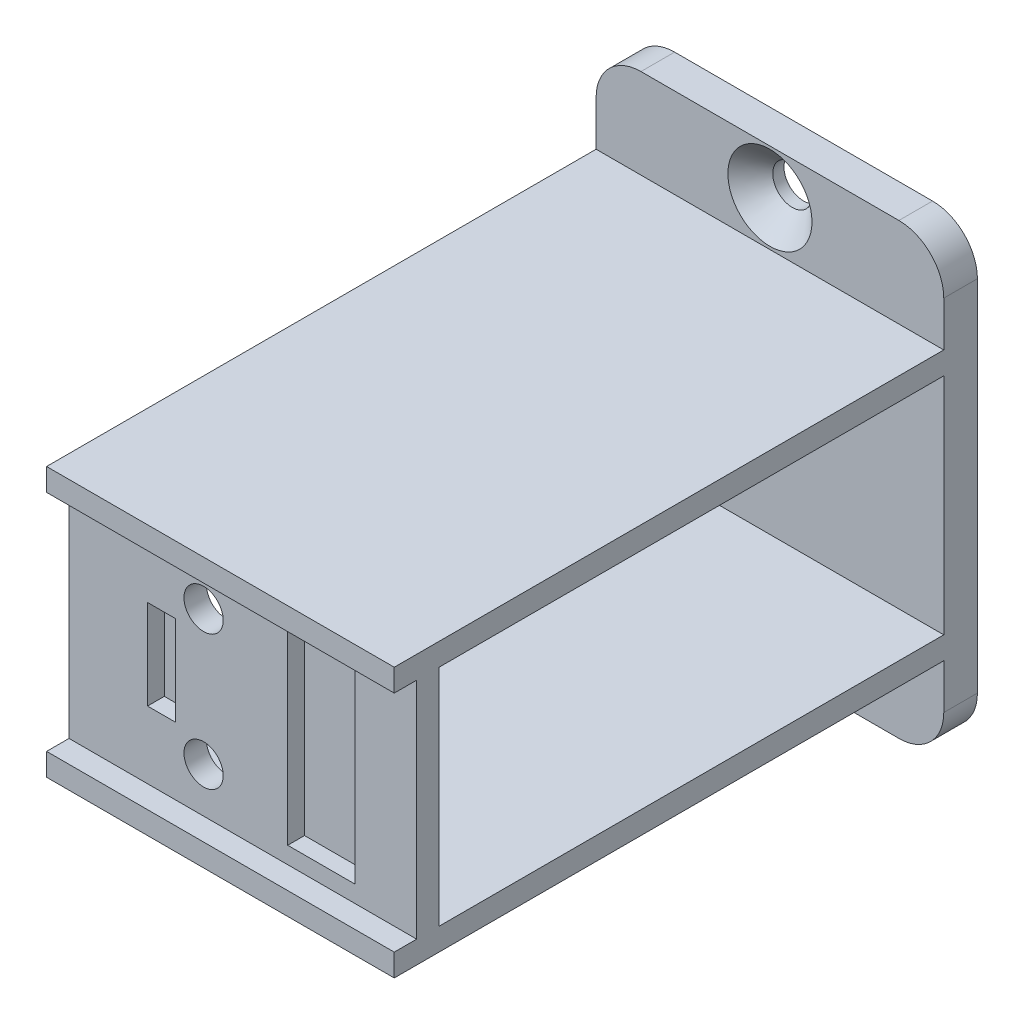
ISO-10303-21;
HEADER;
FILE_DESCRIPTION(('STEP AP214'),'2;1');
FILE_NAME('part.step','',(''),(''),'','','');
FILE_SCHEMA(('AUTOMOTIVE_DESIGN { 1 0 10303 214 1 1 1 1 }'));
ENDSEC;
DATA;
#1=APPLICATION_CONTEXT('core data for automotive mechanical design processes');
#2=APPLICATION_PROTOCOL_DEFINITION('international standard','automotive_design',2000,#1);
#3=PRODUCT_CONTEXT('',#1,'mechanical');
#4=PRODUCT('Part','Part','',(#3));
#5=PRODUCT_RELATED_PRODUCT_CATEGORY('part','',(#4));
#6=PRODUCT_DEFINITION_FORMATION('','',#4);
#7=PRODUCT_DEFINITION_CONTEXT('part definition',#1,'design');
#8=PRODUCT_DEFINITION('design','',#6,#7);
#9=PRODUCT_DEFINITION_SHAPE('','',#8);
#10=(LENGTH_UNIT() NAMED_UNIT(*) SI_UNIT(.MILLI.,.METRE.));
#11=(NAMED_UNIT(*) PLANE_ANGLE_UNIT() SI_UNIT($,.RADIAN.));
#12=(NAMED_UNIT(*) SI_UNIT($,.STERADIAN.) SOLID_ANGLE_UNIT());
#13=UNCERTAINTY_MEASURE_WITH_UNIT(LENGTH_MEASURE(1.E-05),#10,'distance_accuracy_value','');
#14=(GEOMETRIC_REPRESENTATION_CONTEXT(3) GLOBAL_UNCERTAINTY_ASSIGNED_CONTEXT((#13)) GLOBAL_UNIT_ASSIGNED_CONTEXT((#10,
#11,#12)) REPRESENTATION_CONTEXT('',''));
#15=CARTESIAN_POINT('',(0.,0.,0.));
#16=DIRECTION('',(0.,0.,1.));
#17=DIRECTION('',(1.,0.,0.));
#18=AXIS2_PLACEMENT_3D('',#15,#16,#17);
#19=CARTESIAN_POINT('',(0.,0.,0.));
#20=DIRECTION('',(0.,0.,-1.));
#21=DIRECTION('',(-1.,0.,0.));
#22=AXIS2_PLACEMENT_3D('',#19,#20,#21);
#23=PLANE('',#22);
#24=CARTESIAN_POINT('',(12.,6.,0.));
#25=DIRECTION('',(0.,0.,-1.));
#26=DIRECTION('',(-1.,0.,0.));
#27=AXIS2_PLACEMENT_3D('',#24,#25,#26);
#28=CIRCLE('',#27,1.75);
#29=CARTESIAN_POINT('',(10.25,6.,0.));
#30=VERTEX_POINT('',#29);
#31=EDGE_CURVE('E265',#30,#30,#28,.T.);
#32=ORIENTED_EDGE('',*,*,#31,.F.);
#33=EDGE_LOOP('',(#32));
#34=FACE_BOUND('',#33,.T.);
#35=CARTESIAN_POINT('',(12.,18.,0.));
#36=DIRECTION('',(0.,0.,-1.));
#37=DIRECTION('',(-1.,0.,0.));
#38=AXIS2_PLACEMENT_3D('',#35,#36,#37);
#39=CIRCLE('',#38,1.75);
#40=CARTESIAN_POINT('',(10.25,18.,0.));
#41=VERTEX_POINT('',#40);
#42=EDGE_CURVE('E260',#41,#41,#39,.T.);
#43=ORIENTED_EDGE('',*,*,#42,.F.);
#44=EDGE_LOOP('',(#43));
#45=FACE_BOUND('',#44,.T.);
#46=DIRECTION('',(0.,1.,0.));
#47=VECTOR('',#46,1.);
#48=CARTESIAN_POINT('',(31.,0.,0.));
#49=LINE('',#48,#47);
#50=CARTESIAN_POINT('',(31.,2.,0.));
#51=VERTEX_POINT('',#50);
#52=CARTESIAN_POINT('',(31.,22.,0.));
#53=VERTEX_POINT('',#52);
#54=EDGE_CURVE('E474',#51,#53,#49,.T.);
#55=ORIENTED_EDGE('',*,*,#54,.F.);
#56=DIRECTION('',(1.,0.,0.));
#57=VECTOR('',#56,1.);
#58=CARTESIAN_POINT('',(31.,2.,0.));
#59=LINE('',#58,#57);
#60=CARTESIAN_POINT('',(0.,2.,0.));
#61=VERTEX_POINT('',#60);
#62=EDGE_CURVE('E348',#61,#51,#59,.T.);
#63=ORIENTED_EDGE('',*,*,#62,.F.);
#64=DIRECTION('',(0.,-1.,0.));
#65=VECTOR('',#64,1.);
#66=CARTESIAN_POINT('',(0.,0.,0.));
#67=LINE('',#66,#65);
#68=CARTESIAN_POINT('',(0.,22.,0.));
#69=VERTEX_POINT('',#68);
#70=EDGE_CURVE('E471',#69,#61,#67,.T.);
#71=ORIENTED_EDGE('',*,*,#70,.F.);
#72=DIRECTION('',(-1.,0.,0.));
#73=VECTOR('',#72,1.);
#74=CARTESIAN_POINT('',(31.,22.,0.));
#75=LINE('',#74,#73);
#76=EDGE_CURVE('E355',#53,#69,#75,.T.);
#77=ORIENTED_EDGE('',*,*,#76,.F.);
#78=EDGE_LOOP('',(#55,#63,#71,#77));
#79=FACE_BOUND('',#78,.T.);
#80=ADVANCED_FACE('F33',(#34,#45,#79),#23,.T.);
#81=CARTESIAN_POINT('',(0.,0.,2.));
#82=DIRECTION('',(0.,0.,-1.));
#83=DIRECTION('',(-1.,0.,0.));
#84=AXIS2_PLACEMENT_3D('',#81,#82,#83);
#85=PLANE('',#84);
#86=DIRECTION('',(1.,0.,0.));
#87=VECTOR('',#86,1.);
#88=CARTESIAN_POINT('',(19.5,3.5,2.));
#89=LINE('',#88,#87);
#90=CARTESIAN_POINT('',(19.5,3.5,2.));
#91=VERTEX_POINT('',#90);
#92=CARTESIAN_POINT('',(25.5,3.5,2.));
#93=VERTEX_POINT('',#92);
#94=EDGE_CURVE('E384',#91,#93,#89,.T.);
#95=ORIENTED_EDGE('',*,*,#94,.F.);
#96=DIRECTION('',(0.,-1.,0.));
#97=VECTOR('',#96,1.);
#98=CARTESIAN_POINT('',(19.5,20.5,2.));
#99=LINE('',#98,#97);
#100=CARTESIAN_POINT('',(19.5,20.5,2.));
#101=VERTEX_POINT('',#100);
#102=EDGE_CURVE('E368',#101,#91,#99,.T.);
#103=ORIENTED_EDGE('',*,*,#102,.F.);
#104=DIRECTION('',(-1.,0.,0.));
#105=VECTOR('',#104,1.);
#106=CARTESIAN_POINT('',(19.5,20.5,2.));
#107=LINE('',#106,#105);
#108=CARTESIAN_POINT('',(25.5,20.5,2.));
#109=VERTEX_POINT('',#108);
#110=EDGE_CURVE('E373',#109,#101,#107,.T.);
#111=ORIENTED_EDGE('',*,*,#110,.F.);
#112=DIRECTION('',(0.,1.,0.));
#113=VECTOR('',#112,1.);
#114=CARTESIAN_POINT('',(25.5,20.5,2.));
#115=LINE('',#114,#113);
#116=EDGE_CURVE('E387',#93,#109,#115,.T.);
#117=ORIENTED_EDGE('',*,*,#116,.F.);
#118=EDGE_LOOP('',(#95,#103,#111,#117));
#119=FACE_BOUND('',#118,.T.);
#120=DIRECTION('',(1.,0.,0.));
#121=VECTOR('',#120,1.);
#122=CARTESIAN_POINT('',(7.,8.,2.));
#123=LINE('',#122,#121);
#124=CARTESIAN_POINT('',(7.,8.,2.));
#125=VERTEX_POINT('',#124);
#126=CARTESIAN_POINT('',(9.5,8.,2.));
#127=VERTEX_POINT('',#126);
#128=EDGE_CURVE('E416',#125,#127,#123,.T.);
#129=ORIENTED_EDGE('',*,*,#128,.F.);
#130=DIRECTION('',(0.,-1.,0.));
#131=VECTOR('',#130,1.);
#132=CARTESIAN_POINT('',(7.,16.,2.));
#133=LINE('',#132,#131);
#134=CARTESIAN_POINT('',(7.,16.,2.));
#135=VERTEX_POINT('',#134);
#136=EDGE_CURVE('E394',#135,#125,#133,.T.);
#137=ORIENTED_EDGE('',*,*,#136,.F.);
#138=DIRECTION('',(-1.,0.,0.));
#139=VECTOR('',#138,1.);
#140=CARTESIAN_POINT('',(7.,16.,2.));
#141=LINE('',#140,#139);
#142=CARTESIAN_POINT('',(9.5,16.,2.));
#143=VERTEX_POINT('',#142);
#144=EDGE_CURVE('E405',#143,#135,#141,.T.);
#145=ORIENTED_EDGE('',*,*,#144,.F.);
#146=DIRECTION('',(0.,1.,0.));
#147=VECTOR('',#146,1.);
#148=CARTESIAN_POINT('',(9.5,16.,2.));
#149=LINE('',#148,#147);
#150=EDGE_CURVE('E419',#127,#143,#149,.T.);
#151=ORIENTED_EDGE('',*,*,#150,.F.);
#152=EDGE_LOOP('',(#129,#137,#145,#151));
#153=FACE_BOUND('',#152,.T.);
#154=CARTESIAN_POINT('',(12.,6.,2.));
#155=DIRECTION('',(0.,0.,1.));
#156=DIRECTION('',(1.,0.,0.));
#157=AXIS2_PLACEMENT_3D('',#154,#155,#156);
#158=CIRCLE('',#157,1.75);
#159=CARTESIAN_POINT('',(13.75,6.,2.));
#160=VERTEX_POINT('',#159);
#161=EDGE_CURVE('E268',#160,#160,#158,.T.);
#162=ORIENTED_EDGE('',*,*,#161,.F.);
#163=EDGE_LOOP('',(#162));
#164=FACE_BOUND('',#163,.T.);
#165=CARTESIAN_POINT('',(12.,18.,2.));
#166=DIRECTION('',(0.,0.,1.));
#167=DIRECTION('',(1.,0.,0.));
#168=AXIS2_PLACEMENT_3D('',#165,#166,#167);
#169=CIRCLE('',#168,1.75);
#170=CARTESIAN_POINT('',(13.75,18.,2.));
#171=VERTEX_POINT('',#170);
#172=EDGE_CURVE('E264',#171,#171,#169,.T.);
#173=ORIENTED_EDGE('',*,*,#172,.F.);
#174=EDGE_LOOP('',(#173));
#175=FACE_BOUND('',#174,.T.);
#176=DIRECTION('',(-1.,0.,0.));
#177=VECTOR('',#176,1.);
#178=CARTESIAN_POINT('',(0.,2.,2.));
#179=LINE('',#178,#177);
#180=CARTESIAN_POINT('',(31.,2.,2.));
#181=VERTEX_POINT('',#180);
#182=CARTESIAN_POINT('',(0.,2.,2.));
#183=VERTEX_POINT('',#182);
#184=EDGE_CURVE('E263',#181,#183,#179,.T.);
#185=ORIENTED_EDGE('',*,*,#184,.F.);
#186=DIRECTION('',(0.,1.,0.));
#187=VECTOR('',#186,1.);
#188=CARTESIAN_POINT('',(31.,0.,2.));
#189=LINE('',#188,#187);
#190=CARTESIAN_POINT('',(31.,22.,2.));
#191=VERTEX_POINT('',#190);
#192=EDGE_CURVE('E253',#181,#191,#189,.T.);
#193=ORIENTED_EDGE('',*,*,#192,.T.);
#194=DIRECTION('',(1.,0.,0.));
#195=VECTOR('',#194,1.);
#196=CARTESIAN_POINT('',(0.,22.,2.));
#197=LINE('',#196,#195);
#198=CARTESIAN_POINT('',(0.,22.,2.));
#199=VERTEX_POINT('',#198);
#200=EDGE_CURVE('E454',#199,#191,#197,.T.);
#201=ORIENTED_EDGE('',*,*,#200,.F.);
#202=DIRECTION('',(0.,-1.,0.));
#203=VECTOR('',#202,1.);
#204=CARTESIAN_POINT('',(0.,0.,2.));
#205=LINE('',#204,#203);
#206=EDGE_CURVE('E472',#199,#183,#205,.T.);
#207=ORIENTED_EDGE('',*,*,#206,.T.);
#208=EDGE_LOOP('',(#185,#193,#201,#207));
#209=FACE_BOUND('',#208,.T.);
#210=ADVANCED_FACE('F533',(#119,#153,#164,#175,#209),#85,.F.);
#211=CARTESIAN_POINT('',(0.,0.,2.));
#212=DIRECTION('',(1.,0.,0.));
#213=DIRECTION('',(0.,0.,-1.));
#214=AXIS2_PLACEMENT_3D('',#211,#212,#213);
#215=PLANE('',#214);
#216=DIRECTION('',(0.,-1.,0.));
#217=VECTOR('',#216,1.);
#218=CARTESIAN_POINT('',(0.,32.,-45.));
#219=LINE('',#218,#217);
#220=CARTESIAN_POINT('',(0.,22.,-45.));
#221=VERTEX_POINT('',#220);
#222=CARTESIAN_POINT('',(0.,2.,-45.));
#223=VERTEX_POINT('',#222);
#224=EDGE_CURVE('E342',#221,#223,#219,.T.);
#225=ORIENTED_EDGE('',*,*,#224,.F.);
#226=DIRECTION('',(0.,0.,1.));
#227=VECTOR('',#226,1.);
#228=CARTESIAN_POINT('',(0.,22.,-48.));
#229=LINE('',#228,#227);
#230=EDGE_CURVE('E362',#221,#69,#229,.T.);
#231=ORIENTED_EDGE('',*,*,#230,.T.);
#232=ORIENTED_EDGE('',*,*,#70,.T.);
#233=DIRECTION('',(0.,0.,1.));
#234=VECTOR('',#233,1.);
#235=CARTESIAN_POINT('',(0.,2.,-48.));
#236=LINE('',#235,#234);
#237=EDGE_CURVE('E353',#223,#61,#236,.T.);
#238=ORIENTED_EDGE('',*,*,#237,.F.);
#239=EDGE_LOOP('',(#225,#231,#232,#238));
#240=FACE_BOUND('',#239,.T.);
#241=DIRECTION('',(0.,1.,0.));
#242=VECTOR('',#241,1.);
#243=CARTESIAN_POINT('',(0.,24.,-48.));
#244=LINE('',#243,#242);
#245=CARTESIAN_POINT('',(0.,-4.,-48.));
#246=VERTEX_POINT('',#245);
#247=CARTESIAN_POINT('',(0.,28.,-48.));
#248=VERTEX_POINT('',#247);
#249=EDGE_CURVE('E359',#246,#248,#244,.T.);
#250=ORIENTED_EDGE('',*,*,#249,.F.);
#251=DIRECTION('',(0.,0.,-1.));
#252=VECTOR('',#251,1.);
#253=CARTESIAN_POINT('',(0.,-4.,2.));
#254=LINE('',#253,#252);
#255=CARTESIAN_POINT('',(0.,-4.,-45.));
#256=VERTEX_POINT('',#255);
#257=EDGE_CURVE('E307',#246,#256,#254,.F.);
#258=ORIENTED_EDGE('',*,*,#257,.T.);
#259=CARTESIAN_POINT('',(0.,0.,-45.));
#260=VERTEX_POINT('',#259);
#261=EDGE_CURVE('E229',#260,#256,#219,.T.);
#262=ORIENTED_EDGE('',*,*,#261,.F.);
#263=DIRECTION('',(0.,0.,-1.));
#264=VECTOR('',#263,1.);
#265=CARTESIAN_POINT('',(0.,0.,2.));
#266=LINE('',#265,#264);
#267=CARTESIAN_POINT('',(0.,0.,4.));
#268=VERTEX_POINT('',#267);
#269=EDGE_CURVE('E251',#268,#260,#266,.T.);
#270=ORIENTED_EDGE('',*,*,#269,.F.);
#271=DIRECTION('',(0.,-1.,0.));
#272=VECTOR('',#271,1.);
#273=CARTESIAN_POINT('',(0.,0.,4.));
#274=LINE('',#273,#272);
#275=CARTESIAN_POINT('',(0.,2.,4.));
#276=VERTEX_POINT('',#275);
#277=EDGE_CURVE('E436',#276,#268,#274,.T.);
#278=ORIENTED_EDGE('',*,*,#277,.F.);
#279=DIRECTION('',(0.,0.,-1.));
#280=VECTOR('',#279,1.);
#281=CARTESIAN_POINT('',(0.,2.,4.));
#282=LINE('',#281,#280);
#283=EDGE_CURVE('E446',#276,#183,#282,.T.);
#284=ORIENTED_EDGE('',*,*,#283,.T.);
#285=ORIENTED_EDGE('',*,*,#206,.F.);
#286=DIRECTION('',(0.,0.,-1.));
#287=VECTOR('',#286,1.);
#288=CARTESIAN_POINT('',(0.,22.,4.));
#289=LINE('',#288,#287);
#290=CARTESIAN_POINT('',(0.,22.,4.));
#291=VERTEX_POINT('',#290);
#292=EDGE_CURVE('E468',#291,#199,#289,.T.);
#293=ORIENTED_EDGE('',*,*,#292,.F.);
#294=DIRECTION('',(0.,-1.,0.));
#295=VECTOR('',#294,1.);
#296=CARTESIAN_POINT('',(0.,24.,4.));
#297=LINE('',#296,#295);
#298=CARTESIAN_POINT('',(0.,24.,4.));
#299=VERTEX_POINT('',#298);
#300=EDGE_CURVE('E455',#299,#291,#297,.T.);
#301=ORIENTED_EDGE('',*,*,#300,.F.);
#302=DIRECTION('',(0.,0.,-1.));
#303=VECTOR('',#302,1.);
#304=CARTESIAN_POINT('',(0.,24.,2.));
#305=LINE('',#304,#303);
#306=CARTESIAN_POINT('',(0.,24.,-45.));
#307=VERTEX_POINT('',#306);
#308=EDGE_CURVE('E248',#299,#307,#305,.T.);
#309=ORIENTED_EDGE('',*,*,#308,.T.);
#310=CARTESIAN_POINT('',(0.,28.,-45.));
#311=VERTEX_POINT('',#310);
#312=EDGE_CURVE('E237',#311,#307,#219,.T.);
#313=ORIENTED_EDGE('',*,*,#312,.F.);
#314=DIRECTION('',(0.,0.,-1.));
#315=VECTOR('',#314,1.);
#316=CARTESIAN_POINT('',(0.,28.,-48.));
#317=LINE('',#316,#315);
#318=EDGE_CURVE('E304',#311,#248,#317,.T.);
#319=ORIENTED_EDGE('',*,*,#318,.T.);
#320=EDGE_LOOP('',(#250,#258,#262,#270,#278,#284,#285,#293,#301,#309,#313,#319));
#321=FACE_BOUND('',#320,.T.);
#322=ADVANCED_FACE('F495',(#240,#321),#215,.F.);
#323=CARTESIAN_POINT('',(0.,0.,2.));
#324=DIRECTION('',(0.,1.,0.));
#325=DIRECTION('',(0.,0.,1.));
#326=AXIS2_PLACEMENT_3D('',#323,#324,#325);
#327=PLANE('',#326);
#328=CARTESIAN_POINT('',(5.,0.,-35.));
#329=DIRECTION('',(0.,-1.,0.));
#330=DIRECTION('',(0.,0.,-1.));
#331=AXIS2_PLACEMENT_3D('',#328,#329,#330);
#332=CIRCLE('',#331,1.5);
#333=CARTESIAN_POINT('',(5.,0.,-36.5));
#334=VERTEX_POINT('',#333);
#335=EDGE_CURVE('E326',#334,#334,#332,.T.);
#336=ORIENTED_EDGE('',*,*,#335,.F.);
#337=EDGE_LOOP('',(#336));
#338=FACE_BOUND('',#337,.T.);
#339=CARTESIAN_POINT('',(5.,0.,-10.));
#340=DIRECTION('',(0.,-1.,0.));
#341=DIRECTION('',(0.,0.,-1.));
#342=AXIS2_PLACEMENT_3D('',#339,#340,#341);
#343=CIRCLE('',#342,1.5);
#344=CARTESIAN_POINT('',(5.,0.,-11.5));
#345=VERTEX_POINT('',#344);
#346=EDGE_CURVE('E315',#345,#345,#343,.T.);
#347=ORIENTED_EDGE('',*,*,#346,.F.);
#348=EDGE_LOOP('',(#347));
#349=FACE_BOUND('',#348,.T.);
#350=ORIENTED_EDGE('',*,*,#269,.T.);
#351=DIRECTION('',(1.,0.,0.));
#352=VECTOR('',#351,1.);
#353=CARTESIAN_POINT('',(0.,0.,-45.));
#354=LINE('',#353,#352);
#355=CARTESIAN_POINT('',(31.,0.,-45.));
#356=VERTEX_POINT('',#355);
#357=EDGE_CURVE('E240',#260,#356,#354,.T.);
#358=ORIENTED_EDGE('',*,*,#357,.T.);
#359=DIRECTION('',(0.,0.,-1.));
#360=VECTOR('',#359,1.);
#361=CARTESIAN_POINT('',(31.,0.,2.));
#362=LINE('',#361,#360);
#363=CARTESIAN_POINT('',(31.,0.,4.));
#364=VERTEX_POINT('',#363);
#365=EDGE_CURVE('E247',#364,#356,#362,.T.);
#366=ORIENTED_EDGE('',*,*,#365,.F.);
#367=DIRECTION('',(1.,0.,0.));
#368=VECTOR('',#367,1.);
#369=CARTESIAN_POINT('',(0.,0.,4.));
#370=LINE('',#369,#368);
#371=EDGE_CURVE('E439',#268,#364,#370,.T.);
#372=ORIENTED_EDGE('',*,*,#371,.F.);
#373=EDGE_LOOP('',(#350,#358,#366,#372));
#374=FACE_BOUND('',#373,.T.);
#375=ADVANCED_FACE('F550',(#338,#349,#374),#327,.F.);
#376=CARTESIAN_POINT('',(31.,0.,2.));
#377=DIRECTION('',(-1.,0.,0.));
#378=DIRECTION('',(0.,0.,1.));
#379=AXIS2_PLACEMENT_3D('',#376,#377,#378);
#380=PLANE('',#379);
#381=DIRECTION('',(0.,-1.,0.));
#382=VECTOR('',#381,1.);
#383=CARTESIAN_POINT('',(31.,32.,-45.));
#384=LINE('',#383,#382);
#385=CARTESIAN_POINT('',(31.,22.,-45.));
#386=VERTEX_POINT('',#385);
#387=CARTESIAN_POINT('',(31.,2.,-45.));
#388=VERTEX_POINT('',#387);
#389=EDGE_CURVE('E230',#386,#388,#384,.T.);
#390=ORIENTED_EDGE('',*,*,#389,.T.);
#391=DIRECTION('',(0.,0.,1.));
#392=VECTOR('',#391,1.);
#393=CARTESIAN_POINT('',(31.,2.,-48.));
#394=LINE('',#393,#392);
#395=EDGE_CURVE('E351',#388,#51,#394,.T.);
#396=ORIENTED_EDGE('',*,*,#395,.T.);
#397=ORIENTED_EDGE('',*,*,#54,.T.);
#398=DIRECTION('',(0.,0.,1.));
#399=VECTOR('',#398,1.);
#400=CARTESIAN_POINT('',(31.,22.,-48.));
#401=LINE('',#400,#399);
#402=EDGE_CURVE('E366',#386,#53,#401,.T.);
#403=ORIENTED_EDGE('',*,*,#402,.F.);
#404=EDGE_LOOP('',(#390,#396,#397,#403));
#405=FACE_BOUND('',#404,.T.);
#406=CARTESIAN_POINT('',(31.,-4.,-45.));
#407=VERTEX_POINT('',#406);
#408=EDGE_CURVE('E232',#356,#407,#384,.T.);
#409=ORIENTED_EDGE('',*,*,#408,.T.);
#410=DIRECTION('',(0.,0.,1.));
#411=VECTOR('',#410,1.);
#412=CARTESIAN_POINT('',(31.,-4.,2.));
#413=LINE('',#412,#411);
#414=CARTESIAN_POINT('',(31.,-4.,-48.));
#415=VERTEX_POINT('',#414);
#416=EDGE_CURVE('E294',#407,#415,#413,.F.);
#417=ORIENTED_EDGE('',*,*,#416,.T.);
#418=DIRECTION('',(0.,-1.,0.));
#419=VECTOR('',#418,1.);
#420=CARTESIAN_POINT('',(31.,24.,-48.));
#421=LINE('',#420,#419);
#422=CARTESIAN_POINT('',(31.,28.,-48.));
#423=VERTEX_POINT('',#422);
#424=EDGE_CURVE('E356',#423,#415,#421,.T.);
#425=ORIENTED_EDGE('',*,*,#424,.F.);
#426=DIRECTION('',(0.,0.,1.));
#427=VECTOR('',#426,1.);
#428=CARTESIAN_POINT('',(31.,28.,-45.));
#429=LINE('',#428,#427);
#430=CARTESIAN_POINT('',(31.,28.,-45.));
#431=VERTEX_POINT('',#430);
#432=EDGE_CURVE('E228',#423,#431,#429,.T.);
#433=ORIENTED_EDGE('',*,*,#432,.T.);
#434=CARTESIAN_POINT('',(31.,24.,-45.));
#435=VERTEX_POINT('',#434);
#436=EDGE_CURVE('E218',#431,#435,#384,.T.);
#437=ORIENTED_EDGE('',*,*,#436,.T.);
#438=DIRECTION('',(0.,0.,-1.));
#439=VECTOR('',#438,1.);
#440=CARTESIAN_POINT('',(31.,24.,2.));
#441=LINE('',#440,#439);
#442=CARTESIAN_POINT('',(31.,24.,4.));
#443=VERTEX_POINT('',#442);
#444=EDGE_CURVE('E224',#443,#435,#441,.T.);
#445=ORIENTED_EDGE('',*,*,#444,.F.);
#446=DIRECTION('',(0.,1.,0.));
#447=VECTOR('',#446,1.);
#448=CARTESIAN_POINT('',(31.,24.,4.));
#449=LINE('',#448,#447);
#450=CARTESIAN_POINT('',(31.,22.,4.));
#451=VERTEX_POINT('',#450);
#452=EDGE_CURVE('E460',#451,#443,#449,.T.);
#453=ORIENTED_EDGE('',*,*,#452,.F.);
#454=DIRECTION('',(0.,0.,-1.));
#455=VECTOR('',#454,1.);
#456=CARTESIAN_POINT('',(31.,22.,4.));
#457=LINE('',#456,#455);
#458=EDGE_CURVE('E463',#451,#191,#457,.T.);
#459=ORIENTED_EDGE('',*,*,#458,.T.);
#460=ORIENTED_EDGE('',*,*,#192,.F.);
#461=DIRECTION('',(0.,0.,-1.));
#462=VECTOR('',#461,1.);
#463=CARTESIAN_POINT('',(31.,2.,4.));
#464=LINE('',#463,#462);
#465=CARTESIAN_POINT('',(31.,2.,4.));
#466=VERTEX_POINT('',#465);
#467=EDGE_CURVE('E451',#466,#181,#464,.T.);
#468=ORIENTED_EDGE('',*,*,#467,.F.);
#469=DIRECTION('',(0.,1.,0.));
#470=VECTOR('',#469,1.);
#471=CARTESIAN_POINT('',(31.,0.,4.));
#472=LINE('',#471,#470);
#473=EDGE_CURVE('E442',#364,#466,#472,.T.);
#474=ORIENTED_EDGE('',*,*,#473,.F.);
#475=ORIENTED_EDGE('',*,*,#365,.T.);
#476=EDGE_LOOP('',(#409,#417,#425,#433,#437,#445,#453,#459,#460,#468,#474,#475));
#477=FACE_BOUND('',#476,.T.);
#478=ADVANCED_FACE('F221',(#405,#477),#380,.F.);
#479=CARTESIAN_POINT('',(0.,24.,2.));
#480=DIRECTION('',(0.,-1.,0.));
#481=DIRECTION('',(0.,0.,-1.));
#482=AXIS2_PLACEMENT_3D('',#479,#480,#481);
#483=PLANE('',#482);
#484=ORIENTED_EDGE('',*,*,#444,.T.);
#485=DIRECTION('',(-1.,0.,0.));
#486=VECTOR('',#485,1.);
#487=CARTESIAN_POINT('',(0.,24.,-45.));
#488=LINE('',#487,#486);
#489=EDGE_CURVE('E234',#435,#307,#488,.T.);
#490=ORIENTED_EDGE('',*,*,#489,.T.);
#491=ORIENTED_EDGE('',*,*,#308,.F.);
#492=DIRECTION('',(-1.,0.,0.));
#493=VECTOR('',#492,1.);
#494=CARTESIAN_POINT('',(0.,24.,4.));
#495=LINE('',#494,#493);
#496=EDGE_CURVE('E246',#443,#299,#495,.T.);
#497=ORIENTED_EDGE('',*,*,#496,.F.);
#498=EDGE_LOOP('',(#484,#490,#491,#497));
#499=FACE_BOUND('',#498,.T.);
#500=ADVANCED_FACE('F244',(#499),#483,.F.);
#501=CARTESIAN_POINT('',(0.,22.,4.));
#502=DIRECTION('',(0.,1.,0.));
#503=DIRECTION('',(0.,0.,1.));
#504=AXIS2_PLACEMENT_3D('',#501,#502,#503);
#505=PLANE('',#504);
#506=ORIENTED_EDGE('',*,*,#200,.T.);
#507=ORIENTED_EDGE('',*,*,#458,.F.);
#508=DIRECTION('',(1.,0.,0.));
#509=VECTOR('',#508,1.);
#510=CARTESIAN_POINT('',(0.,22.,4.));
#511=LINE('',#510,#509);
#512=EDGE_CURVE('E458',#291,#451,#511,.T.);
#513=ORIENTED_EDGE('',*,*,#512,.F.);
#514=ORIENTED_EDGE('',*,*,#292,.T.);
#515=EDGE_LOOP('',(#506,#507,#513,#514));
#516=FACE_BOUND('',#515,.T.);
#517=ADVANCED_FACE('F547',(#516),#505,.F.);
#518=CARTESIAN_POINT('',(0.,0.,4.));
#519=DIRECTION('',(0.,0.,1.));
#520=DIRECTION('',(1.,0.,0.));
#521=AXIS2_PLACEMENT_3D('',#518,#519,#520);
#522=PLANE('',#521);
#523=ORIENTED_EDGE('',*,*,#300,.T.);
#524=ORIENTED_EDGE('',*,*,#512,.T.);
#525=ORIENTED_EDGE('',*,*,#452,.T.);
#526=ORIENTED_EDGE('',*,*,#496,.T.);
#527=EDGE_LOOP('',(#523,#524,#525,#526));
#528=FACE_BOUND('',#527,.T.);
#529=ADVANCED_FACE('F583',(#528),#522,.T.);
#530=CARTESIAN_POINT('',(0.,2.,4.));
#531=DIRECTION('',(0.,-1.,0.));
#532=DIRECTION('',(0.,0.,-1.));
#533=AXIS2_PLACEMENT_3D('',#530,#531,#532);
#534=PLANE('',#533);
#535=ORIENTED_EDGE('',*,*,#184,.T.);
#536=ORIENTED_EDGE('',*,*,#283,.F.);
#537=DIRECTION('',(-1.,0.,0.));
#538=VECTOR('',#537,1.);
#539=CARTESIAN_POINT('',(0.,2.,4.));
#540=LINE('',#539,#538);
#541=EDGE_CURVE('E444',#466,#276,#540,.T.);
#542=ORIENTED_EDGE('',*,*,#541,.F.);
#543=ORIENTED_EDGE('',*,*,#467,.T.);
#544=EDGE_LOOP('',(#535,#536,#542,#543));
#545=FACE_BOUND('',#544,.T.);
#546=ADVANCED_FACE('F594',(#545),#534,.F.);
#547=CARTESIAN_POINT('',(0.,0.,4.));
#548=DIRECTION('',(0.,0.,-1.));
#549=DIRECTION('',(-1.,0.,0.));
#550=AXIS2_PLACEMENT_3D('',#547,#548,#549);
#551=PLANE('',#550);
#552=ORIENTED_EDGE('',*,*,#277,.T.);
#553=ORIENTED_EDGE('',*,*,#371,.T.);
#554=ORIENTED_EDGE('',*,*,#473,.T.);
#555=ORIENTED_EDGE('',*,*,#541,.T.);
#556=EDGE_LOOP('',(#552,#553,#554,#555));
#557=FACE_BOUND('',#556,.T.);
#558=ADVANCED_FACE('F596',(#557),#551,.F.);
#559=CARTESIAN_POINT('',(12.,18.,-1.));
#560=DIRECTION('',(0.,0.,1.));
#561=DIRECTION('',(1.,0.,0.));
#562=AXIS2_PLACEMENT_3D('',#559,#560,#561);
#563=CYLINDRICAL_SURFACE('',#562,1.75);
#564=ORIENTED_EDGE('',*,*,#42,.T.);
#565=EDGE_LOOP('',(#564));
#566=FACE_BOUND('',#565,.T.);
#567=ORIENTED_EDGE('',*,*,#172,.T.);
#568=EDGE_LOOP('',(#567));
#569=FACE_BOUND('',#568,.T.);
#570=ADVANCED_FACE('F600',(#566,#569),#563,.F.);
#571=CARTESIAN_POINT('',(12.,6.,-1.));
#572=DIRECTION('',(0.,0.,1.));
#573=DIRECTION('',(1.,0.,0.));
#574=AXIS2_PLACEMENT_3D('',#571,#572,#573);
#575=CYLINDRICAL_SURFACE('',#574,1.75);
#576=ORIENTED_EDGE('',*,*,#31,.T.);
#577=EDGE_LOOP('',(#576));
#578=FACE_BOUND('',#577,.T.);
#579=ORIENTED_EDGE('',*,*,#161,.T.);
#580=EDGE_LOOP('',(#579));
#581=FACE_BOUND('',#580,.T.);
#582=ADVANCED_FACE('F606',(#578,#581),#575,.F.);
#583=CARTESIAN_POINT('',(7.,16.,0.5));
#584=DIRECTION('',(-1.,0.,0.));
#585=DIRECTION('',(0.,0.,1.));
#586=AXIS2_PLACEMENT_3D('',#583,#584,#585);
#587=PLANE('',#586);
#588=ORIENTED_EDGE('',*,*,#136,.T.);
#589=DIRECTION('',(0.,0.,1.));
#590=VECTOR('',#589,1.);
#591=CARTESIAN_POINT('',(7.,8.,0.5));
#592=LINE('',#591,#590);
#593=CARTESIAN_POINT('',(7.,8.,0.5));
#594=VERTEX_POINT('',#593);
#595=EDGE_CURVE('E414',#594,#125,#592,.T.);
#596=ORIENTED_EDGE('',*,*,#595,.F.);
#597=DIRECTION('',(0.,-1.,0.));
#598=VECTOR('',#597,1.);
#599=CARTESIAN_POINT('',(7.,16.,0.5));
#600=LINE('',#599,#598);
#601=CARTESIAN_POINT('',(7.,16.,0.5));
#602=VERTEX_POINT('',#601);
#603=EDGE_CURVE('E401',#602,#594,#600,.T.);
#604=ORIENTED_EDGE('',*,*,#603,.F.);
#605=DIRECTION('',(0.,0.,1.));
#606=VECTOR('',#605,1.);
#607=CARTESIAN_POINT('',(7.,16.,0.5));
#608=LINE('',#607,#606);
#609=EDGE_CURVE('E424',#602,#135,#608,.T.);
#610=ORIENTED_EDGE('',*,*,#609,.T.);
#611=EDGE_LOOP('',(#588,#596,#604,#610));
#612=FACE_BOUND('',#611,.T.);
#613=ADVANCED_FACE('F645',(#612),#587,.F.);
#614=CARTESIAN_POINT('',(7.,16.,0.5));
#615=DIRECTION('',(0.,1.,0.));
#616=DIRECTION('',(0.,0.,1.));
#617=AXIS2_PLACEMENT_3D('',#614,#615,#616);
#618=PLANE('',#617);
#619=ORIENTED_EDGE('',*,*,#144,.T.);
#620=ORIENTED_EDGE('',*,*,#609,.F.);
#621=DIRECTION('',(-1.,0.,0.));
#622=VECTOR('',#621,1.);
#623=CARTESIAN_POINT('',(7.,16.,0.5));
#624=LINE('',#623,#622);
#625=CARTESIAN_POINT('',(9.5,16.,0.5));
#626=VERTEX_POINT('',#625);
#627=EDGE_CURVE('E411',#626,#602,#624,.T.);
#628=ORIENTED_EDGE('',*,*,#627,.F.);
#629=DIRECTION('',(0.,0.,1.));
#630=VECTOR('',#629,1.);
#631=CARTESIAN_POINT('',(9.5,16.,0.5));
#632=LINE('',#631,#630);
#633=EDGE_CURVE('E426',#626,#143,#632,.T.);
#634=ORIENTED_EDGE('',*,*,#633,.T.);
#635=EDGE_LOOP('',(#619,#620,#628,#634));
#636=FACE_BOUND('',#635,.T.);
#637=ADVANCED_FACE('F662',(#636),#618,.F.);
#638=CARTESIAN_POINT('',(9.5,16.,0.5));
#639=DIRECTION('',(1.,0.,0.));
#640=DIRECTION('',(0.,0.,-1.));
#641=AXIS2_PLACEMENT_3D('',#638,#639,#640);
#642=PLANE('',#641);
#643=ORIENTED_EDGE('',*,*,#150,.T.);
#644=ORIENTED_EDGE('',*,*,#633,.F.);
#645=DIRECTION('',(0.,1.,0.));
#646=VECTOR('',#645,1.);
#647=CARTESIAN_POINT('',(9.5,16.,0.5));
#648=LINE('',#647,#646);
#649=CARTESIAN_POINT('',(9.5,8.,0.5));
#650=VERTEX_POINT('',#649);
#651=EDGE_CURVE('E408',#650,#626,#648,.T.);
#652=ORIENTED_EDGE('',*,*,#651,.F.);
#653=DIRECTION('',(0.,0.,1.));
#654=VECTOR('',#653,1.);
#655=CARTESIAN_POINT('',(9.5,8.,0.5));
#656=LINE('',#655,#654);
#657=EDGE_CURVE('E428',#650,#127,#656,.T.);
#658=ORIENTED_EDGE('',*,*,#657,.T.);
#659=EDGE_LOOP('',(#643,#644,#652,#658));
#660=FACE_BOUND('',#659,.T.);
#661=ADVANCED_FACE('F672',(#660),#642,.F.);
#662=CARTESIAN_POINT('',(7.,8.,0.5));
#663=DIRECTION('',(0.,-1.,0.));
#664=DIRECTION('',(0.,0.,-1.));
#665=AXIS2_PLACEMENT_3D('',#662,#663,#664);
#666=PLANE('',#665);
#667=ORIENTED_EDGE('',*,*,#128,.T.);
#668=ORIENTED_EDGE('',*,*,#657,.F.);
#669=DIRECTION('',(1.,0.,0.));
#670=VECTOR('',#669,1.);
#671=CARTESIAN_POINT('',(7.,8.,0.5));
#672=LINE('',#671,#670);
#673=EDGE_CURVE('E404',#594,#650,#672,.T.);
#674=ORIENTED_EDGE('',*,*,#673,.F.);
#675=ORIENTED_EDGE('',*,*,#595,.T.);
#676=EDGE_LOOP('',(#667,#668,#674,#675));
#677=FACE_BOUND('',#676,.T.);
#678=ADVANCED_FACE('F682',(#677),#666,.F.);
#679=CARTESIAN_POINT('',(0.,0.,0.5));
#680=DIRECTION('',(0.,0.,1.));
#681=DIRECTION('',(1.,0.,0.));
#682=AXIS2_PLACEMENT_3D('',#679,#680,#681);
#683=PLANE('',#682);
#684=ORIENTED_EDGE('',*,*,#603,.T.);
#685=ORIENTED_EDGE('',*,*,#673,.T.);
#686=ORIENTED_EDGE('',*,*,#651,.T.);
#687=ORIENTED_EDGE('',*,*,#627,.T.);
#688=EDGE_LOOP('',(#684,#685,#686,#687));
#689=FACE_BOUND('',#688,.T.);
#690=ADVANCED_FACE('F692',(#689),#683,.T.);
#691=CARTESIAN_POINT('',(19.5,20.5,0.5));
#692=DIRECTION('',(-1.,0.,0.));
#693=DIRECTION('',(0.,-1.,0.));
#694=AXIS2_PLACEMENT_3D('',#691,#692,#693);
#695=PLANE('',#694);
#696=ORIENTED_EDGE('',*,*,#102,.T.);
#697=DIRECTION('',(0.,0.,1.));
#698=VECTOR('',#697,1.);
#699=CARTESIAN_POINT('',(19.5,3.5,0.5));
#700=LINE('',#699,#698);
#701=CARTESIAN_POINT('',(19.5,3.5,0.5));
#702=VERTEX_POINT('',#701);
#703=EDGE_CURVE('E382',#702,#91,#700,.T.);
#704=ORIENTED_EDGE('',*,*,#703,.F.);
#705=DIRECTION('',(0.,-1.,0.));
#706=VECTOR('',#705,1.);
#707=CARTESIAN_POINT('',(19.5,20.5,0.5));
#708=LINE('',#707,#706);
#709=CARTESIAN_POINT('',(19.5,20.5,0.5));
#710=VERTEX_POINT('',#709);
#711=EDGE_CURVE('E369',#710,#702,#708,.T.);
#712=ORIENTED_EDGE('',*,*,#711,.F.);
#713=DIRECTION('',(0.,0.,1.));
#714=VECTOR('',#713,1.);
#715=CARTESIAN_POINT('',(19.5,20.5,0.5));
#716=LINE('',#715,#714);
#717=EDGE_CURVE('E392',#710,#101,#716,.T.);
#718=ORIENTED_EDGE('',*,*,#717,.T.);
#719=EDGE_LOOP('',(#696,#704,#712,#718));
#720=FACE_BOUND('',#719,.T.);
#721=ADVANCED_FACE('F702',(#720),#695,.F.);
#722=CARTESIAN_POINT('',(19.5,20.5,0.5));
#723=DIRECTION('',(0.,1.,0.));
#724=DIRECTION('',(0.,0.,1.));
#725=AXIS2_PLACEMENT_3D('',#722,#723,#724);
#726=PLANE('',#725);
#727=ORIENTED_EDGE('',*,*,#110,.T.);
#728=ORIENTED_EDGE('',*,*,#717,.F.);
#729=DIRECTION('',(-1.,0.,0.));
#730=VECTOR('',#729,1.);
#731=CARTESIAN_POINT('',(19.5,20.5,0.5));
#732=LINE('',#731,#730);
#733=CARTESIAN_POINT('',(25.5,20.5,0.5));
#734=VERTEX_POINT('',#733);
#735=EDGE_CURVE('E379',#734,#710,#732,.T.);
#736=ORIENTED_EDGE('',*,*,#735,.F.);
#737=DIRECTION('',(0.,0.,1.));
#738=VECTOR('',#737,1.);
#739=CARTESIAN_POINT('',(25.5,20.5,0.5));
#740=LINE('',#739,#738);
#741=EDGE_CURVE('E395',#734,#109,#740,.T.);
#742=ORIENTED_EDGE('',*,*,#741,.T.);
#743=EDGE_LOOP('',(#727,#728,#736,#742));
#744=FACE_BOUND('',#743,.T.);
#745=ADVANCED_FACE('F712',(#744),#726,.F.);
#746=CARTESIAN_POINT('',(25.5,20.5,0.5));
#747=DIRECTION('',(1.,0.,0.));
#748=DIRECTION('',(0.,0.,-1.));
#749=AXIS2_PLACEMENT_3D('',#746,#747,#748);
#750=PLANE('',#749);
#751=ORIENTED_EDGE('',*,*,#116,.T.);
#752=ORIENTED_EDGE('',*,*,#741,.F.);
#753=DIRECTION('',(0.,1.,0.));
#754=VECTOR('',#753,1.);
#755=CARTESIAN_POINT('',(25.5,20.5,0.5));
#756=LINE('',#755,#754);
#757=CARTESIAN_POINT('',(25.5,3.5,0.5));
#758=VERTEX_POINT('',#757);
#759=EDGE_CURVE('E376',#758,#734,#756,.T.);
#760=ORIENTED_EDGE('',*,*,#759,.F.);
#761=DIRECTION('',(0.,0.,1.));
#762=VECTOR('',#761,1.);
#763=CARTESIAN_POINT('',(25.5,3.5,0.5));
#764=LINE('',#763,#762);
#765=EDGE_CURVE('E397',#758,#93,#764,.T.);
#766=ORIENTED_EDGE('',*,*,#765,.T.);
#767=EDGE_LOOP('',(#751,#752,#760,#766));
#768=FACE_BOUND('',#767,.T.);
#769=ADVANCED_FACE('F722',(#768),#750,.F.);
#770=CARTESIAN_POINT('',(19.5,3.5,0.5));
#771=DIRECTION('',(0.,-1.,0.));
#772=DIRECTION('',(0.,0.,-1.));
#773=AXIS2_PLACEMENT_3D('',#770,#771,#772);
#774=PLANE('',#773);
#775=ORIENTED_EDGE('',*,*,#94,.T.);
#776=ORIENTED_EDGE('',*,*,#765,.F.);
#777=DIRECTION('',(1.,0.,0.));
#778=VECTOR('',#777,1.);
#779=CARTESIAN_POINT('',(19.5,3.5,0.5));
#780=LINE('',#779,#778);
#781=EDGE_CURVE('E372',#702,#758,#780,.T.);
#782=ORIENTED_EDGE('',*,*,#781,.F.);
#783=ORIENTED_EDGE('',*,*,#703,.T.);
#784=EDGE_LOOP('',(#775,#776,#782,#783));
#785=FACE_BOUND('',#784,.T.);
#786=ADVANCED_FACE('F732',(#785),#774,.F.);
#787=CARTESIAN_POINT('',(0.,0.,0.5));
#788=DIRECTION('',(0.,0.,1.));
#789=DIRECTION('',(1.,0.,0.));
#790=AXIS2_PLACEMENT_3D('',#787,#788,#789);
#791=PLANE('',#790);
#792=ORIENTED_EDGE('',*,*,#711,.T.);
#793=ORIENTED_EDGE('',*,*,#781,.T.);
#794=ORIENTED_EDGE('',*,*,#759,.T.);
#795=ORIENTED_EDGE('',*,*,#735,.T.);
#796=EDGE_LOOP('',(#792,#793,#794,#795));
#797=FACE_BOUND('',#796,.T.);
#798=ADVANCED_FACE('F742',(#797),#791,.T.);
#799=CARTESIAN_POINT('',(31.,22.,-48.));
#800=DIRECTION('',(0.,1.,0.));
#801=DIRECTION('',(0.,0.,1.));
#802=AXIS2_PLACEMENT_3D('',#799,#800,#801);
#803=PLANE('',#802);
#804=ORIENTED_EDGE('',*,*,#230,.F.);
#805=DIRECTION('',(1.,0.,0.));
#806=VECTOR('',#805,1.);
#807=CARTESIAN_POINT('',(31.,22.,-45.));
#808=LINE('',#807,#806);
#809=EDGE_CURVE('E241',#221,#386,#808,.T.);
#810=ORIENTED_EDGE('',*,*,#809,.T.);
#811=ORIENTED_EDGE('',*,*,#402,.T.);
#812=ORIENTED_EDGE('',*,*,#76,.T.);
#813=EDGE_LOOP('',(#804,#810,#811,#812));
#814=FACE_BOUND('',#813,.T.);
#815=ADVANCED_FACE('F489',(#814),#803,.F.);
#816=CARTESIAN_POINT('',(0.,0.,-48.));
#817=DIRECTION('',(0.,0.,-1.));
#818=DIRECTION('',(-1.,0.,0.));
#819=AXIS2_PLACEMENT_3D('',#816,#817,#818);
#820=PLANE('',#819);
#821=CARTESIAN_POINT('',(15.5,-4.,-48.));
#822=DIRECTION('',(0.,0.,-1.));
#823=DIRECTION('',(-1.,0.,0.));
#824=AXIS2_PLACEMENT_3D('',#821,#822,#823);
#825=CIRCLE('',#824,1.75);
#826=CARTESIAN_POINT('',(13.75,-4.,-48.));
#827=VERTEX_POINT('',#826);
#828=EDGE_CURVE('E314',#827,#827,#825,.T.);
#829=ORIENTED_EDGE('',*,*,#828,.F.);
#830=EDGE_LOOP('',(#829));
#831=FACE_BOUND('',#830,.T.);
#832=CARTESIAN_POINT('',(15.5,28.,-48.));
#833=DIRECTION('',(0.,0.,-1.));
#834=DIRECTION('',(-1.,0.,0.));
#835=AXIS2_PLACEMENT_3D('',#832,#833,#834);
#836=CIRCLE('',#835,1.75);
#837=CARTESIAN_POINT('',(13.75,28.,-48.));
#838=VERTEX_POINT('',#837);
#839=EDGE_CURVE('E319',#838,#838,#836,.T.);
#840=ORIENTED_EDGE('',*,*,#839,.F.);
#841=EDGE_LOOP('',(#840));
#842=FACE_BOUND('',#841,.T.);
#843=ORIENTED_EDGE('',*,*,#424,.T.);
#844=CARTESIAN_POINT('',(27.,-4.,-48.));
#845=DIRECTION('',(0.,0.,-1.));
#846=DIRECTION('',(-1.,0.,0.));
#847=AXIS2_PLACEMENT_3D('',#844,#845,#846);
#848=CIRCLE('',#847,4.);
#849=CARTESIAN_POINT('',(27.,-8.,-48.));
#850=VERTEX_POINT('',#849);
#851=EDGE_CURVE('E302',#415,#850,#848,.T.);
#852=ORIENTED_EDGE('',*,*,#851,.T.);
#853=DIRECTION('',(1.,0.,0.));
#854=VECTOR('',#853,1.);
#855=CARTESIAN_POINT('',(0.,-8.,-48.));
#856=LINE('',#855,#854);
#857=CARTESIAN_POINT('',(4.,-8.,-48.));
#858=VERTEX_POINT('',#857);
#859=EDGE_CURVE('E331',#858,#850,#856,.T.);
#860=ORIENTED_EDGE('',*,*,#859,.F.);
#861=CARTESIAN_POINT('',(4.,-4.,-48.));
#862=DIRECTION('',(0.,0.,-1.));
#863=DIRECTION('',(-1.,0.,0.));
#864=AXIS2_PLACEMENT_3D('',#861,#862,#863);
#865=CIRCLE('',#864,4.);
#866=EDGE_CURVE('E300',#858,#246,#865,.T.);
#867=ORIENTED_EDGE('',*,*,#866,.T.);
#868=ORIENTED_EDGE('',*,*,#249,.T.);
#869=CARTESIAN_POINT('',(4.,28.,-48.));
#870=DIRECTION('',(0.,0.,-1.));
#871=DIRECTION('',(-1.,0.,0.));
#872=AXIS2_PLACEMENT_3D('',#869,#870,#871);
#873=CIRCLE('',#872,4.);
#874=CARTESIAN_POINT('',(4.,32.,-48.));
#875=VERTEX_POINT('',#874);
#876=EDGE_CURVE('E296',#248,#875,#873,.T.);
#877=ORIENTED_EDGE('',*,*,#876,.T.);
#878=DIRECTION('',(1.,0.,0.));
#879=VECTOR('',#878,1.);
#880=CARTESIAN_POINT('',(0.,32.,-48.));
#881=LINE('',#880,#879);
#882=CARTESIAN_POINT('',(27.,32.,-48.));
#883=VERTEX_POINT('',#882);
#884=EDGE_CURVE('E332',#875,#883,#881,.T.);
#885=ORIENTED_EDGE('',*,*,#884,.T.);
#886=CARTESIAN_POINT('',(27.,28.,-48.));
#887=DIRECTION('',(0.,0.,-1.));
#888=DIRECTION('',(-1.,0.,0.));
#889=AXIS2_PLACEMENT_3D('',#886,#887,#888);
#890=CIRCLE('',#889,4.);
#891=EDGE_CURVE('E298',#883,#423,#890,.T.);
#892=ORIENTED_EDGE('',*,*,#891,.T.);
#893=EDGE_LOOP('',(#843,#852,#860,#867,#868,#877,#885,#892));
#894=FACE_BOUND('',#893,.T.);
#895=ADVANCED_FACE('F512',(#831,#842,#894),#820,.T.);
#896=CARTESIAN_POINT('',(31.,2.,-48.));
#897=DIRECTION('',(0.,-1.,0.));
#898=DIRECTION('',(1.,0.,0.));
#899=AXIS2_PLACEMENT_3D('',#896,#897,#898);
#900=PLANE('',#899);
#901=CARTESIAN_POINT('',(5.,2.,-35.));
#902=DIRECTION('',(0.,-1.,0.));
#903=DIRECTION('',(1.,0.,0.));
#904=AXIS2_PLACEMENT_3D('',#901,#902,#903);
#905=CIRCLE('',#904,1.5);
#906=CARTESIAN_POINT('',(6.5,2.,-35.));
#907=VERTEX_POINT('',#906);
#908=EDGE_CURVE('E37',#907,#907,#905,.T.);
#909=ORIENTED_EDGE('',*,*,#908,.T.);
#910=EDGE_LOOP('',(#909));
#911=FACE_BOUND('',#910,.T.);
#912=CARTESIAN_POINT('',(5.,2.,-10.));
#913=DIRECTION('',(0.,-1.,0.));
#914=DIRECTION('',(1.,0.,0.));
#915=AXIS2_PLACEMENT_3D('',#912,#913,#914);
#916=CIRCLE('',#915,1.5);
#917=CARTESIAN_POINT('',(6.5,2.,-10.));
#918=VERTEX_POINT('',#917);
#919=EDGE_CURVE('E312',#918,#918,#916,.T.);
#920=ORIENTED_EDGE('',*,*,#919,.T.);
#921=EDGE_LOOP('',(#920));
#922=FACE_BOUND('',#921,.T.);
#923=ORIENTED_EDGE('',*,*,#395,.F.);
#924=DIRECTION('',(-1.,0.,0.));
#925=VECTOR('',#924,1.);
#926=CARTESIAN_POINT('',(31.,2.,-45.));
#927=LINE('',#926,#925);
#928=EDGE_CURVE('E259',#388,#223,#927,.T.);
#929=ORIENTED_EDGE('',*,*,#928,.T.);
#930=ORIENTED_EDGE('',*,*,#237,.T.);
#931=ORIENTED_EDGE('',*,*,#62,.T.);
#932=EDGE_LOOP('',(#923,#929,#930,#931));
#933=FACE_BOUND('',#932,.T.);
#934=ADVANCED_FACE('F520',(#911,#922,#933),#900,.F.);
#935=CARTESIAN_POINT('',(0.,32.,-45.));
#936=DIRECTION('',(0.,0.,1.));
#937=DIRECTION('',(1.,0.,0.));
#938=AXIS2_PLACEMENT_3D('',#935,#936,#937);
#939=PLANE('',#938);
#940=ORIENTED_EDGE('',*,*,#809,.F.);
#941=ORIENTED_EDGE('',*,*,#224,.T.);
#942=ORIENTED_EDGE('',*,*,#928,.F.);
#943=ORIENTED_EDGE('',*,*,#389,.F.);
#944=EDGE_LOOP('',(#940,#941,#942,#943));
#945=FACE_BOUND('',#944,.T.);
#946=ADVANCED_FACE('F492',(#945),#939,.T.);
#947=CARTESIAN_POINT('',(0.,32.,0.));
#948=DIRECTION('',(0.,1.,0.));
#949=DIRECTION('',(0.,0.,1.));
#950=AXIS2_PLACEMENT_3D('',#947,#948,#949);
#951=PLANE('',#950);
#952=DIRECTION('',(-1.,0.,0.));
#953=VECTOR('',#952,1.);
#954=CARTESIAN_POINT('',(0.,32.,-45.));
#955=LINE('',#954,#953);
#956=CARTESIAN_POINT('',(27.,32.,-45.));
#957=VERTEX_POINT('',#956);
#958=CARTESIAN_POINT('',(4.,32.,-45.));
#959=VERTEX_POINT('',#958);
#960=EDGE_CURVE('E335',#957,#959,#955,.T.);
#961=ORIENTED_EDGE('',*,*,#960,.F.);
#962=DIRECTION('',(0.,0.,1.));
#963=VECTOR('',#962,1.);
#964=CARTESIAN_POINT('',(27.,32.,-48.));
#965=LINE('',#964,#963);
#966=EDGE_CURVE('E11',#957,#883,#965,.F.);
#967=ORIENTED_EDGE('',*,*,#966,.T.);
#968=ORIENTED_EDGE('',*,*,#884,.F.);
#969=DIRECTION('',(0.,0.,-1.));
#970=VECTOR('',#969,1.);
#971=CARTESIAN_POINT('',(4.,32.,-45.));
#972=LINE('',#971,#970);
#973=EDGE_CURVE('E42',#875,#959,#972,.F.);
#974=ORIENTED_EDGE('',*,*,#973,.T.);
#975=EDGE_LOOP('',(#961,#967,#968,#974));
#976=FACE_BOUND('',#975,.T.);
#977=ADVANCED_FACE('F528',(#976),#951,.T.);
#978=CARTESIAN_POINT('',(15.5,28.,-45.));
#979=DIRECTION('',(0.,0.,1.));
#980=DIRECTION('',(1.,0.,0.));
#981=AXIS2_PLACEMENT_3D('',#978,#979,#980);
#982=CIRCLE('',#981,3.75);
#983=CARTESIAN_POINT('',(19.25,28.,-45.));
#984=VERTEX_POINT('',#983);
#985=EDGE_CURVE('E280',#984,#984,#982,.F.);
#986=ORIENTED_EDGE('',*,*,#985,.T.);
#987=EDGE_LOOP('',(#986));
#988=FACE_BOUND('',#987,.T.);
#989=ORIENTED_EDGE('',*,*,#436,.F.);
#990=CARTESIAN_POINT('',(27.,28.,-45.));
#991=DIRECTION('',(0.,0.,1.));
#992=DIRECTION('',(1.,0.,0.));
#993=AXIS2_PLACEMENT_3D('',#990,#991,#992);
#994=CIRCLE('',#993,4.);
#995=EDGE_CURVE('E56',#431,#957,#994,.T.);
#996=ORIENTED_EDGE('',*,*,#995,.T.);
#997=ORIENTED_EDGE('',*,*,#960,.T.);
#998=CARTESIAN_POINT('',(4.,28.,-45.));
#999=DIRECTION('',(0.,0.,1.));
#1000=DIRECTION('',(1.,0.,0.));
#1001=AXIS2_PLACEMENT_3D('',#998,#999,#1000);
#1002=CIRCLE('',#1001,4.);
#1003=EDGE_CURVE('E309',#959,#311,#1002,.T.);
#1004=ORIENTED_EDGE('',*,*,#1003,.T.);
#1005=ORIENTED_EDGE('',*,*,#312,.T.);
#1006=ORIENTED_EDGE('',*,*,#489,.F.);
#1007=EDGE_LOOP('',(#989,#996,#997,#1004,#1005,#1006));
#1008=FACE_BOUND('',#1007,.T.);
#1009=ADVANCED_FACE('F235',(#988,#1008),#939,.T.);
#1010=CARTESIAN_POINT('',(15.5,-4.,-45.));
#1011=DIRECTION('',(0.,0.,1.));
#1012=DIRECTION('',(1.,0.,0.));
#1013=AXIS2_PLACEMENT_3D('',#1010,#1011,#1012);
#1014=CIRCLE('',#1013,3.75);
#1015=CARTESIAN_POINT('',(19.25,-4.,-45.));
#1016=VERTEX_POINT('',#1015);
#1017=EDGE_CURVE('E274',#1016,#1016,#1014,.F.);
#1018=ORIENTED_EDGE('',*,*,#1017,.T.);
#1019=EDGE_LOOP('',(#1018));
#1020=FACE_BOUND('',#1019,.T.);
#1021=DIRECTION('',(-1.,0.,0.));
#1022=VECTOR('',#1021,1.);
#1023=CARTESIAN_POINT('',(0.,-8.,-45.));
#1024=LINE('',#1023,#1022);
#1025=CARTESIAN_POINT('',(27.,-8.,-45.));
#1026=VERTEX_POINT('',#1025);
#1027=CARTESIAN_POINT('',(4.,-8.,-45.));
#1028=VERTEX_POINT('',#1027);
#1029=EDGE_CURVE('E336',#1026,#1028,#1024,.T.);
#1030=ORIENTED_EDGE('',*,*,#1029,.F.);
#1031=CARTESIAN_POINT('',(27.,-4.,-45.));
#1032=DIRECTION('',(0.,0.,1.));
#1033=DIRECTION('',(1.,0.,0.));
#1034=AXIS2_PLACEMENT_3D('',#1031,#1032,#1033);
#1035=CIRCLE('',#1034,4.);
#1036=EDGE_CURVE('E291',#1026,#407,#1035,.T.);
#1037=ORIENTED_EDGE('',*,*,#1036,.T.);
#1038=ORIENTED_EDGE('',*,*,#408,.F.);
#1039=ORIENTED_EDGE('',*,*,#357,.F.);
#1040=ORIENTED_EDGE('',*,*,#261,.T.);
#1041=CARTESIAN_POINT('',(4.,-4.,-45.));
#1042=DIRECTION('',(0.,0.,1.));
#1043=DIRECTION('',(1.,0.,0.));
#1044=AXIS2_PLACEMENT_3D('',#1041,#1042,#1043);
#1045=CIRCLE('',#1044,4.);
#1046=EDGE_CURVE('E289',#256,#1028,#1045,.T.);
#1047=ORIENTED_EDGE('',*,*,#1046,.T.);
#1048=EDGE_LOOP('',(#1030,#1037,#1038,#1039,#1040,#1047));
#1049=FACE_BOUND('',#1048,.T.);
#1050=ADVANCED_FACE('F502',(#1020,#1049),#939,.T.);
#1051=CARTESIAN_POINT('',(0.,-8.,0.));
#1052=DIRECTION('',(0.,1.,0.));
#1053=DIRECTION('',(0.,0.,1.));
#1054=AXIS2_PLACEMENT_3D('',#1051,#1052,#1053);
#1055=PLANE('',#1054);
#1056=ORIENTED_EDGE('',*,*,#859,.T.);
#1057=DIRECTION('',(0.,0.,1.));
#1058=VECTOR('',#1057,1.);
#1059=CARTESIAN_POINT('',(27.,-8.,0.));
#1060=LINE('',#1059,#1058);
#1061=EDGE_CURVE('E286',#850,#1026,#1060,.T.);
#1062=ORIENTED_EDGE('',*,*,#1061,.T.);
#1063=ORIENTED_EDGE('',*,*,#1029,.T.);
#1064=DIRECTION('',(0.,0.,-1.));
#1065=VECTOR('',#1064,1.);
#1066=CARTESIAN_POINT('',(4.,-8.,0.));
#1067=LINE('',#1066,#1065);
#1068=EDGE_CURVE('E283',#1028,#858,#1067,.T.);
#1069=ORIENTED_EDGE('',*,*,#1068,.T.);
#1070=EDGE_LOOP('',(#1056,#1062,#1063,#1069));
#1071=FACE_BOUND('',#1070,.T.);
#1072=ADVANCED_FACE('F509',(#1071),#1055,.F.);
#1073=CARTESIAN_POINT('',(15.5,28.,-83.));
#1074=DIRECTION('',(0.,0.,1.));
#1075=DIRECTION('',(1.,0.,0.));
#1076=AXIS2_PLACEMENT_3D('',#1073,#1074,#1075);
#1077=CYLINDRICAL_SURFACE('',#1076,1.75);
#1078=CARTESIAN_POINT('',(15.5,28.,-47.));
#1079=DIRECTION('',(0.,0.,1.));
#1080=DIRECTION('',(1.,0.,0.));
#1081=AXIS2_PLACEMENT_3D('',#1078,#1079,#1080);
#1082=CIRCLE('',#1081,1.75);
#1083=CARTESIAN_POINT('',(17.25,28.,-47.));
#1084=VERTEX_POINT('',#1083);
#1085=EDGE_CURVE('E277',#1084,#1084,#1082,.T.);
#1086=ORIENTED_EDGE('',*,*,#1085,.T.);
#1087=EDGE_LOOP('',(#1086));
#1088=FACE_BOUND('',#1087,.T.);
#1089=ORIENTED_EDGE('',*,*,#839,.T.);
#1090=EDGE_LOOP('',(#1089));
#1091=FACE_BOUND('',#1090,.T.);
#1092=ADVANCED_FACE('F786',(#1088,#1091),#1077,.F.);
#1093=CARTESIAN_POINT('',(15.5,-4.,-83.));
#1094=DIRECTION('',(0.,0.,1.));
#1095=DIRECTION('',(1.,0.,0.));
#1096=AXIS2_PLACEMENT_3D('',#1093,#1094,#1095);
#1097=CYLINDRICAL_SURFACE('',#1096,1.75);
#1098=CARTESIAN_POINT('',(15.5,-4.,-47.));
#1099=DIRECTION('',(0.,0.,1.));
#1100=DIRECTION('',(1.,0.,0.));
#1101=AXIS2_PLACEMENT_3D('',#1098,#1099,#1100);
#1102=CIRCLE('',#1101,1.75);
#1103=CARTESIAN_POINT('',(17.25,-4.,-47.));
#1104=VERTEX_POINT('',#1103);
#1105=EDGE_CURVE('E271',#1104,#1104,#1102,.T.);
#1106=ORIENTED_EDGE('',*,*,#1105,.T.);
#1107=EDGE_LOOP('',(#1106));
#1108=FACE_BOUND('',#1107,.T.);
#1109=ORIENTED_EDGE('',*,*,#828,.T.);
#1110=EDGE_LOOP('',(#1109));
#1111=FACE_BOUND('',#1110,.T.);
#1112=ADVANCED_FACE('F560',(#1108,#1111),#1097,.F.);
#1113=CARTESIAN_POINT('',(15.5,-4.,-47.));
#1114=DIRECTION('',(0.,0.,1.));
#1115=DIRECTION('',(1.,0.,0.));
#1116=AXIS2_PLACEMENT_3D('',#1113,#1114,#1115);
#1117=CONICAL_SURFACE('',#1116,1.75,0.78539816339745);
#1118=ORIENTED_EDGE('',*,*,#1017,.F.);
#1119=EDGE_LOOP('',(#1118));
#1120=FACE_BOUND('',#1119,.T.);
#1121=ORIENTED_EDGE('',*,*,#1105,.F.);
#1122=EDGE_LOOP('',(#1121));
#1123=FACE_BOUND('',#1122,.T.);
#1124=ADVANCED_FACE('F556',(#1120,#1123),#1117,.F.);
#1125=CARTESIAN_POINT('',(15.5,28.,-47.));
#1126=DIRECTION('',(0.,0.,1.));
#1127=DIRECTION('',(1.,0.,0.));
#1128=AXIS2_PLACEMENT_3D('',#1125,#1126,#1127);
#1129=CONICAL_SURFACE('',#1128,1.75,0.78539816339745);
#1130=ORIENTED_EDGE('',*,*,#985,.F.);
#1131=EDGE_LOOP('',(#1130));
#1132=FACE_BOUND('',#1131,.T.);
#1133=ORIENTED_EDGE('',*,*,#1085,.F.);
#1134=EDGE_LOOP('',(#1133));
#1135=FACE_BOUND('',#1134,.T.);
#1136=ADVANCED_FACE('F559',(#1132,#1135),#1129,.F.);
#1137=CARTESIAN_POINT('',(27.,-4.,0.));
#1138=DIRECTION('',(0.,0.,1.));
#1139=DIRECTION('',(1.,0.,0.));
#1140=AXIS2_PLACEMENT_3D('',#1137,#1138,#1139);
#1141=CYLINDRICAL_SURFACE('',#1140,4.);
#1142=ORIENTED_EDGE('',*,*,#851,.F.);
#1143=ORIENTED_EDGE('',*,*,#416,.F.);
#1144=ORIENTED_EDGE('',*,*,#1036,.F.);
#1145=ORIENTED_EDGE('',*,*,#1061,.F.);
#1146=EDGE_LOOP('',(#1142,#1143,#1144,#1145));
#1147=FACE_BOUND('',#1146,.T.);
#1148=ADVANCED_FACE('F517',(#1147),#1141,.T.);
#1149=CARTESIAN_POINT('',(4.,-4.,0.));
#1150=DIRECTION('',(0.,0.,-1.));
#1151=DIRECTION('',(-1.,0.,0.));
#1152=AXIS2_PLACEMENT_3D('',#1149,#1150,#1151);
#1153=CYLINDRICAL_SURFACE('',#1152,4.);
#1154=ORIENTED_EDGE('',*,*,#1046,.F.);
#1155=ORIENTED_EDGE('',*,*,#257,.F.);
#1156=ORIENTED_EDGE('',*,*,#866,.F.);
#1157=ORIENTED_EDGE('',*,*,#1068,.F.);
#1158=EDGE_LOOP('',(#1154,#1155,#1156,#1157));
#1159=FACE_BOUND('',#1158,.T.);
#1160=ADVANCED_FACE('F506',(#1159),#1153,.T.);
#1161=CARTESIAN_POINT('',(27.,28.,2.));
#1162=DIRECTION('',(0.,0.,-1.));
#1163=DIRECTION('',(-1.,0.,0.));
#1164=AXIS2_PLACEMENT_3D('',#1161,#1162,#1163);
#1165=CYLINDRICAL_SURFACE('',#1164,4.);
#1166=ORIENTED_EDGE('',*,*,#891,.F.);
#1167=ORIENTED_EDGE('',*,*,#966,.F.);
#1168=ORIENTED_EDGE('',*,*,#995,.F.);
#1169=ORIENTED_EDGE('',*,*,#432,.F.);
#1170=EDGE_LOOP('',(#1166,#1167,#1168,#1169));
#1171=FACE_BOUND('',#1170,.T.);
#1172=ADVANCED_FACE('F568',(#1171),#1165,.T.);
#1173=CARTESIAN_POINT('',(4.,28.,2.));
#1174=DIRECTION('',(0.,0.,1.));
#1175=DIRECTION('',(1.,0.,0.));
#1176=AXIS2_PLACEMENT_3D('',#1173,#1174,#1175);
#1177=CYLINDRICAL_SURFACE('',#1176,4.);
#1178=ORIENTED_EDGE('',*,*,#1003,.F.);
#1179=ORIENTED_EDGE('',*,*,#973,.F.);
#1180=ORIENTED_EDGE('',*,*,#876,.F.);
#1181=ORIENTED_EDGE('',*,*,#318,.F.);
#1182=EDGE_LOOP('',(#1178,#1179,#1180,#1181));
#1183=FACE_BOUND('',#1182,.T.);
#1184=ADVANCED_FACE('F35',(#1183),#1177,.T.);
#1185=CARTESIAN_POINT('',(5.,5.,-10.));
#1186=DIRECTION('',(0.,-1.,0.));
#1187=DIRECTION('',(0.,0.,-1.));
#1188=AXIS2_PLACEMENT_3D('',#1185,#1186,#1187);
#1189=CYLINDRICAL_SURFACE('',#1188,1.5);
#1190=ORIENTED_EDGE('',*,*,#346,.T.);
#1191=EDGE_LOOP('',(#1190));
#1192=FACE_BOUND('',#1191,.T.);
#1193=ORIENTED_EDGE('',*,*,#919,.F.);
#1194=EDGE_LOOP('',(#1193));
#1195=FACE_BOUND('',#1194,.T.);
#1196=ADVANCED_FACE('F574',(#1192,#1195),#1189,.F.);
#1197=CARTESIAN_POINT('',(5.,5.,-35.));
#1198=DIRECTION('',(0.,-1.,0.));
#1199=DIRECTION('',(0.,0.,-1.));
#1200=AXIS2_PLACEMENT_3D('',#1197,#1198,#1199);
#1201=CYLINDRICAL_SURFACE('',#1200,1.5);
#1202=ORIENTED_EDGE('',*,*,#335,.T.);
#1203=EDGE_LOOP('',(#1202));
#1204=FACE_BOUND('',#1203,.T.);
#1205=ORIENTED_EDGE('',*,*,#908,.F.);
#1206=EDGE_LOOP('',(#1205));
#1207=FACE_BOUND('',#1206,.T.);
#1208=ADVANCED_FACE('F904',(#1204,#1207),#1201,.F.);
#1209=CLOSED_SHELL('',(#80,#210,#322,#375,#478,#500,#517,#529,#546,#558,#570,#582,#613,#637,
#661,#678,#690,#721,#745,#769,#786,#798,#815,#895,#934,#946,#977,#1009,#1050,#1072,#1092,#1112,
#1124,#1136,#1148,#1160,#1172,#1184,#1196,#1208));
#1210=MANIFOLD_SOLID_BREP('B2',#1209);
#1211=ADVANCED_BREP_SHAPE_REPRESENTATION('',(#18,#1210),#14);
#1212=SHAPE_DEFINITION_REPRESENTATION(#9,#1211);
ENDSEC;
END-ISO-10303-21;
